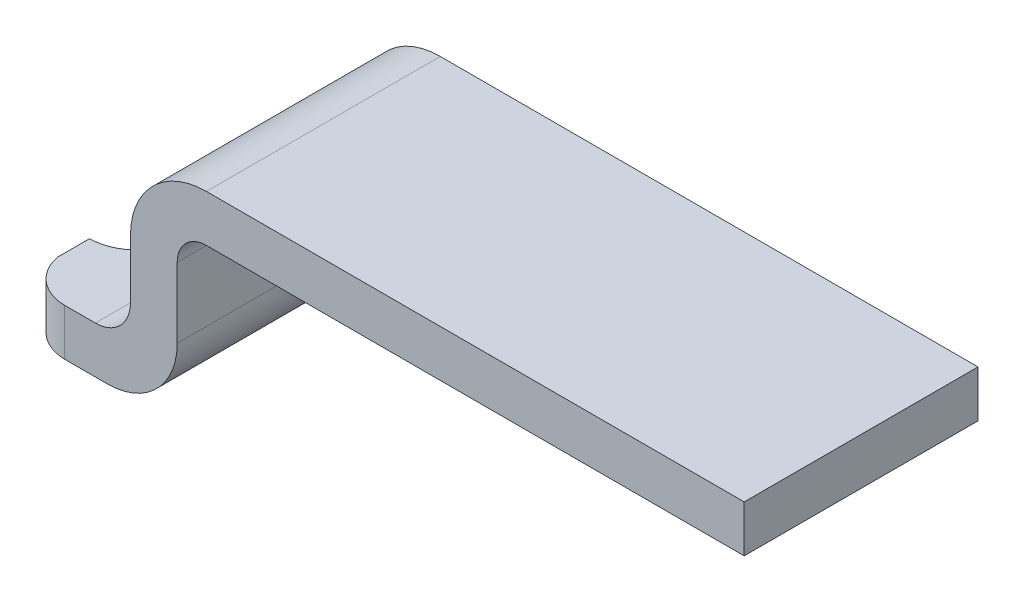
ISO-10303-21;
HEADER;
FILE_DESCRIPTION(('STEP AP214'),'2;1');
FILE_NAME('part.step','',(''),(''),'','','');
FILE_SCHEMA(('AUTOMOTIVE_DESIGN { 1 0 10303 214 1 1 1 1 }'));
ENDSEC;
DATA;
#1=APPLICATION_CONTEXT('core data for automotive mechanical design processes');
#2=APPLICATION_PROTOCOL_DEFINITION('international standard','automotive_design',2000,#1);
#3=PRODUCT_CONTEXT('',#1,'mechanical');
#4=PRODUCT('Part','Part','',(#3));
#5=PRODUCT_RELATED_PRODUCT_CATEGORY('part','',(#4));
#6=PRODUCT_DEFINITION_FORMATION('','',#4);
#7=PRODUCT_DEFINITION_CONTEXT('part definition',#1,'design');
#8=PRODUCT_DEFINITION('design','',#6,#7);
#9=PRODUCT_DEFINITION_SHAPE('','',#8);
#10=(LENGTH_UNIT() NAMED_UNIT(*) SI_UNIT(.MILLI.,.METRE.));
#11=(NAMED_UNIT(*) PLANE_ANGLE_UNIT() SI_UNIT($,.RADIAN.));
#12=(NAMED_UNIT(*) SI_UNIT($,.STERADIAN.) SOLID_ANGLE_UNIT());
#13=UNCERTAINTY_MEASURE_WITH_UNIT(LENGTH_MEASURE(1.E-05),#10,'distance_accuracy_value','');
#14=(GEOMETRIC_REPRESENTATION_CONTEXT(3) GLOBAL_UNCERTAINTY_ASSIGNED_CONTEXT((#13)) GLOBAL_UNIT_ASSIGNED_CONTEXT((#10,
#11,#12)) REPRESENTATION_CONTEXT('',''));
#15=CARTESIAN_POINT('',(0.,0.,0.));
#16=DIRECTION('',(0.,0.,1.));
#17=DIRECTION('',(1.,0.,0.));
#18=AXIS2_PLACEMENT_3D('',#15,#16,#17);
#19=CARTESIAN_POINT('',(-3.45,0.3,-9.));
#20=DIRECTION('',(0.,1.,0.));
#21=DIRECTION('',(1.,0.,0.));
#22=AXIS2_PLACEMENT_3D('',#19,#20,#21);
#23=PLANE('',#22);
#24=DIRECTION('',(0.,0.,-1.));
#25=VECTOR('',#24,1.);
#26=CARTESIAN_POINT('',(-4.1,0.3,-9.));
#27=LINE('',#26,#25);
#28=CARTESIAN_POINT('',(-4.1,0.3,-9.32633336103622));
#29=VERTEX_POINT('',#28);
#30=CARTESIAN_POINT('',(-4.1,0.3,-9.6));
#31=VERTEX_POINT('',#30);
#32=EDGE_CURVE('E42',#29,#31,#27,.T.);
#33=ORIENTED_EDGE('',*,*,#32,.F.);
#34=CARTESIAN_POINT('',(-3.70683202464768,0.3,-9.39994683233988));
#35=DIRECTION('',(0.,1.,0.));
#36=DIRECTION('',(-1.,0.,0.));
#37=AXIS2_PLACEMENT_3D('',#34,#35,#36);
#38=CIRCLE('',#37,0.4);
#39=CARTESIAN_POINT('',(-3.71335362731123,0.3,-9.));
#40=VERTEX_POINT('',#39);
#41=EDGE_CURVE('E11',#29,#40,#38,.T.);
#42=ORIENTED_EDGE('',*,*,#41,.T.);
#43=DIRECTION('',(1.,0.,0.));
#44=VECTOR('',#43,1.);
#45=CARTESIAN_POINT('',(-3.45,0.3,-9.));
#46=LINE('',#45,#44);
#47=CARTESIAN_POINT('',(-3.45,0.3,-9.));
#48=VERTEX_POINT('',#47);
#49=EDGE_CURVE('E28',#40,#48,#46,.T.);
#50=ORIENTED_EDGE('',*,*,#49,.T.);
#51=DIRECTION('',(0.,0.,-1.));
#52=VECTOR('',#51,1.);
#53=CARTESIAN_POINT('',(-3.45,0.3,-9.));
#54=LINE('',#53,#52);
#55=CARTESIAN_POINT('',(-3.45,0.3,-11.));
#56=VERTEX_POINT('',#55);
#57=EDGE_CURVE('E148',#48,#56,#54,.T.);
#58=ORIENTED_EDGE('',*,*,#57,.T.);
#59=DIRECTION('',(1.,0.,0.));
#60=VECTOR('',#59,1.);
#61=CARTESIAN_POINT('',(-3.45,0.3,-11.));
#62=LINE('',#61,#60);
#63=CARTESIAN_POINT('',(-3.7280808421013,0.3,-11.));
#64=VERTEX_POINT('',#63);
#65=EDGE_CURVE('E201',#64,#56,#62,.T.);
#66=ORIENTED_EDGE('',*,*,#65,.F.);
#67=CARTESIAN_POINT('',(-3.70478861389911,0.3,-10.600678735721));
#68=DIRECTION('',(0.,1.,0.));
#69=DIRECTION('',(-1.,0.,0.));
#70=AXIS2_PLACEMENT_3D('',#67,#68,#69);
#71=CIRCLE('',#70,0.399999999999992);
#72=CARTESIAN_POINT('',(-4.1,0.3,-10.6623874085007));
#73=VERTEX_POINT('',#72);
#74=EDGE_CURVE('E268',#64,#73,#71,.T.);
#75=ORIENTED_EDGE('',*,*,#74,.T.);
#76=DIRECTION('',(0.,0.,-1.));
#77=VECTOR('',#76,1.);
#78=CARTESIAN_POINT('',(-4.1,0.3,-9.));
#79=LINE('',#78,#77);
#80=CARTESIAN_POINT('',(-4.1,0.3,-10.4));
#81=VERTEX_POINT('',#80);
#82=EDGE_CURVE('E281',#81,#73,#79,.T.);
#83=ORIENTED_EDGE('',*,*,#82,.F.);
#84=CARTESIAN_POINT('',(-4.1,0.3,-10.));
#85=DIRECTION('',(0.,1.,0.));
#86=DIRECTION('',(-1.,0.,0.));
#87=AXIS2_PLACEMENT_3D('',#84,#85,#86);
#88=CIRCLE('',#87,0.4);
#89=EDGE_CURVE('E212',#31,#81,#88,.T.);
#90=ORIENTED_EDGE('',*,*,#89,.F.);
#91=EDGE_LOOP('',(#33,#42,#50,#58,#66,#75,#83,#90));
#92=FACE_BOUND('',#91,.T.);
#93=ADVANCED_FACE('F17',(#92),#23,.T.);
#94=CARTESIAN_POINT('',(-4.1,0.3,-9.));
#95=DIRECTION('',(-1.,0.,0.));
#96=DIRECTION('',(0.,0.,1.));
#97=AXIS2_PLACEMENT_3D('',#94,#95,#96);
#98=PLANE('',#97);
#99=DIRECTION('',(0.,0.,-1.));
#100=VECTOR('',#99,1.);
#101=CARTESIAN_POINT('',(-4.1,-0.1,-9.));
#102=LINE('',#101,#100);
#103=CARTESIAN_POINT('',(-4.1,-0.1,-9.32633336103622));
#104=VERTEX_POINT('',#103);
#105=CARTESIAN_POINT('',(-4.1,-0.1,-9.6));
#106=VERTEX_POINT('',#105);
#107=EDGE_CURVE('E249',#104,#106,#102,.T.);
#108=ORIENTED_EDGE('',*,*,#107,.F.);
#109=DIRECTION('',(0.,1.,0.));
#110=VECTOR('',#109,1.);
#111=CARTESIAN_POINT('',(-4.1,-0.8,-9.32633336103622));
#112=LINE('',#111,#110);
#113=EDGE_CURVE('E272',#104,#29,#112,.T.);
#114=ORIENTED_EDGE('',*,*,#113,.T.);
#115=ORIENTED_EDGE('',*,*,#32,.T.);
#116=DIRECTION('',(0.,1.,0.));
#117=VECTOR('',#116,1.);
#118=CARTESIAN_POINT('',(-4.1,-0.8,-9.6));
#119=LINE('',#118,#117);
#120=EDGE_CURVE('E213',#106,#31,#119,.T.);
#121=ORIENTED_EDGE('',*,*,#120,.F.);
#122=EDGE_LOOP('',(#108,#114,#115,#121));
#123=FACE_BOUND('',#122,.T.);
#124=ADVANCED_FACE('F341',(#123),#98,.T.);
#125=CARTESIAN_POINT('',(-4.1,0.3,-9.));
#126=DIRECTION('',(-1.,0.,0.));
#127=DIRECTION('',(0.,0.,1.));
#128=AXIS2_PLACEMENT_3D('',#125,#126,#127);
#129=PLANE('',#128);
#130=ORIENTED_EDGE('',*,*,#82,.T.);
#131=DIRECTION('',(0.,1.,0.));
#132=VECTOR('',#131,1.);
#133=CARTESIAN_POINT('',(-4.1,-0.8,-10.6623874085007));
#134=LINE('',#133,#132);
#135=CARTESIAN_POINT('',(-4.1,-0.1,-10.6623874085007));
#136=VERTEX_POINT('',#135);
#137=EDGE_CURVE('E218',#136,#73,#134,.T.);
#138=ORIENTED_EDGE('',*,*,#137,.F.);
#139=DIRECTION('',(0.,0.,-1.));
#140=VECTOR('',#139,1.);
#141=CARTESIAN_POINT('',(-4.1,-0.1,-9.));
#142=LINE('',#141,#140);
#143=CARTESIAN_POINT('',(-4.1,-0.1,-10.4));
#144=VERTEX_POINT('',#143);
#145=EDGE_CURVE('E254',#144,#136,#142,.T.);
#146=ORIENTED_EDGE('',*,*,#145,.F.);
#147=DIRECTION('',(0.,1.,0.));
#148=VECTOR('',#147,1.);
#149=CARTESIAN_POINT('',(-4.1,-0.8,-10.4));
#150=LINE('',#149,#148);
#151=EDGE_CURVE('E294',#144,#81,#150,.T.);
#152=ORIENTED_EDGE('',*,*,#151,.T.);
#153=EDGE_LOOP('',(#130,#138,#146,#152));
#154=FACE_BOUND('',#153,.T.);
#155=ADVANCED_FACE('F328',(#154),#129,.T.);
#156=CARTESIAN_POINT('',(-4.1,-0.1,-9.));
#157=DIRECTION('',(0.,-1.,0.));
#158=DIRECTION('',(-1.,0.,0.));
#159=AXIS2_PLACEMENT_3D('',#156,#157,#158);
#160=PLANE('',#159);
#161=DIRECTION('',(-1.,0.,0.));
#162=VECTOR('',#161,1.);
#163=CARTESIAN_POINT('',(-4.1,-0.1,-9.));
#164=LINE('',#163,#162);
#165=CARTESIAN_POINT('',(-3.35,-0.1,-9.));
#166=VERTEX_POINT('',#165);
#167=CARTESIAN_POINT('',(-3.71335362731091,-0.1,-9.));
#168=VERTEX_POINT('',#167);
#169=EDGE_CURVE('E288',#166,#168,#164,.T.);
#170=ORIENTED_EDGE('',*,*,#169,.T.);
#171=CARTESIAN_POINT('',(-3.70683202464768,-0.1,-9.39994683233988));
#172=DIRECTION('',(0.,-1.,0.));
#173=DIRECTION('',(1.,0.,0.));
#174=AXIS2_PLACEMENT_3D('',#171,#172,#173);
#175=CIRCLE('',#174,0.4);
#176=EDGE_CURVE('E253',#168,#104,#175,.T.);
#177=ORIENTED_EDGE('',*,*,#176,.T.);
#178=ORIENTED_EDGE('',*,*,#107,.T.);
#179=CARTESIAN_POINT('',(-4.1,-0.1,-10.));
#180=DIRECTION('',(0.,-1.,0.));
#181=DIRECTION('',(1.,0.,0.));
#182=AXIS2_PLACEMENT_3D('',#179,#180,#181);
#183=CIRCLE('',#182,0.4);
#184=EDGE_CURVE('E208',#144,#106,#183,.T.);
#185=ORIENTED_EDGE('',*,*,#184,.F.);
#186=ORIENTED_EDGE('',*,*,#145,.T.);
#187=CARTESIAN_POINT('',(-3.70478861389911,-0.1,-10.600678735721));
#188=DIRECTION('',(0.,-1.,0.));
#189=DIRECTION('',(1.,0.,0.));
#190=AXIS2_PLACEMENT_3D('',#187,#188,#189);
#191=CIRCLE('',#190,0.399999999999991);
#192=CARTESIAN_POINT('',(-3.72808084210088,-0.1,-11.));
#193=VERTEX_POINT('',#192);
#194=EDGE_CURVE('E304',#136,#193,#191,.T.);
#195=ORIENTED_EDGE('',*,*,#194,.T.);
#196=DIRECTION('',(-1.,0.,0.));
#197=VECTOR('',#196,1.);
#198=CARTESIAN_POINT('',(-4.1,-0.1,-11.));
#199=LINE('',#198,#197);
#200=CARTESIAN_POINT('',(-3.35,-0.1,-11.));
#201=VERTEX_POINT('',#200);
#202=EDGE_CURVE('E308',#201,#193,#199,.T.);
#203=ORIENTED_EDGE('',*,*,#202,.F.);
#204=DIRECTION('',(0.,0.,-1.));
#205=VECTOR('',#204,1.);
#206=CARTESIAN_POINT('',(-3.35,-0.1,-9.));
#207=LINE('',#206,#205);
#208=EDGE_CURVE('E177',#166,#201,#207,.T.);
#209=ORIENTED_EDGE('',*,*,#208,.F.);
#210=EDGE_LOOP('',(#170,#177,#178,#185,#186,#195,#203,#209));
#211=FACE_BOUND('',#210,.T.);
#212=ADVANCED_FACE('F336',(#211),#160,.T.);
#213=CARTESIAN_POINT('',(-2.5,1.1,-9.));
#214=DIRECTION('',(0.,0.,-1.));
#215=DIRECTION('',(0.,-1.,0.));
#216=AXIS2_PLACEMENT_3D('',#213,#214,#215);
#217=PLANE('',#216);
#218=DIRECTION('',(0.,1.,0.));
#219=VECTOR('',#218,1.);
#220=CARTESIAN_POINT('',(-3.71335362731091,-0.8,-9.));
#221=LINE('',#220,#219);
#222=EDGE_CURVE('E267',#168,#40,#221,.T.);
#223=ORIENTED_EDGE('',*,*,#222,.F.);
#224=ORIENTED_EDGE('',*,*,#169,.F.);
#225=CARTESIAN_POINT('',(-3.35,0.5,-9.));
#226=DIRECTION('',(0.,0.,-1.));
#227=DIRECTION('',(1.,0.,0.));
#228=AXIS2_PLACEMENT_3D('',#225,#226,#227);
#229=CIRCLE('',#228,0.6);
#230=CARTESIAN_POINT('',(-2.75,0.5,-9.));
#231=VERTEX_POINT('',#230);
#232=EDGE_CURVE('E170',#231,#166,#229,.T.);
#233=ORIENTED_EDGE('',*,*,#232,.F.);
#234=DIRECTION('',(0.,-1.,0.));
#235=VECTOR('',#234,1.);
#236=CARTESIAN_POINT('',(-2.75,0.5,-9.));
#237=LINE('',#236,#235);
#238=CARTESIAN_POINT('',(-2.75,1.1,-9.));
#239=VERTEX_POINT('',#238);
#240=EDGE_CURVE('E262',#239,#231,#237,.T.);
#241=ORIENTED_EDGE('',*,*,#240,.F.);
#242=CARTESIAN_POINT('',(-2.5,1.1,-9.));
#243=DIRECTION('',(0.,0.,1.));
#244=DIRECTION('',(-1.,0.,0.));
#245=AXIS2_PLACEMENT_3D('',#242,#243,#244);
#246=CIRCLE('',#245,0.25);
#247=CARTESIAN_POINT('',(-2.5,1.35,-9.));
#248=VERTEX_POINT('',#247);
#249=EDGE_CURVE('E263',#248,#239,#246,.T.);
#250=ORIENTED_EDGE('',*,*,#249,.F.);
#251=DIRECTION('',(-1.,0.,0.));
#252=VECTOR('',#251,1.);
#253=CARTESIAN_POINT('',(2.1,1.35,-9.));
#254=LINE('',#253,#252);
#255=CARTESIAN_POINT('',(2.1,1.35,-9.));
#256=VERTEX_POINT('',#255);
#257=EDGE_CURVE('E182',#256,#248,#254,.T.);
#258=ORIENTED_EDGE('',*,*,#257,.F.);
#259=DIRECTION('',(0.,-1.,0.));
#260=VECTOR('',#259,1.);
#261=CARTESIAN_POINT('',(2.1,1.75,-9.));
#262=LINE('',#261,#260);
#263=CARTESIAN_POINT('',(2.1,1.75,-9.));
#264=VERTEX_POINT('',#263);
#265=EDGE_CURVE('E219',#264,#256,#262,.T.);
#266=ORIENTED_EDGE('',*,*,#265,.F.);
#267=DIRECTION('',(1.,0.,0.));
#268=VECTOR('',#267,1.);
#269=CARTESIAN_POINT('',(2.1,1.75,-9.));
#270=LINE('',#269,#268);
#271=CARTESIAN_POINT('',(-2.5,1.75,-9.));
#272=VERTEX_POINT('',#271);
#273=EDGE_CURVE('E191',#272,#264,#270,.T.);
#274=ORIENTED_EDGE('',*,*,#273,.F.);
#275=CARTESIAN_POINT('',(-2.5,1.1,-9.));
#276=DIRECTION('',(0.,0.,-1.));
#277=DIRECTION('',(1.,0.,0.));
#278=AXIS2_PLACEMENT_3D('',#275,#276,#277);
#279=CIRCLE('',#278,0.65);
#280=CARTESIAN_POINT('',(-3.15,1.1,-9.));
#281=VERTEX_POINT('',#280);
#282=EDGE_CURVE('E159',#281,#272,#279,.T.);
#283=ORIENTED_EDGE('',*,*,#282,.F.);
#284=DIRECTION('',(0.,1.,0.));
#285=VECTOR('',#284,1.);
#286=CARTESIAN_POINT('',(-3.15,1.1,-9.));
#287=LINE('',#286,#285);
#288=CARTESIAN_POINT('',(-3.15,0.6,-9.));
#289=VERTEX_POINT('',#288);
#290=EDGE_CURVE('E155',#289,#281,#287,.T.);
#291=ORIENTED_EDGE('',*,*,#290,.F.);
#292=CARTESIAN_POINT('',(-3.45,0.6,-9.));
#293=DIRECTION('',(0.,0.,1.));
#294=DIRECTION('',(-1.,0.,0.));
#295=AXIS2_PLACEMENT_3D('',#292,#293,#294);
#296=CIRCLE('',#295,0.3);
#297=EDGE_CURVE('E141',#48,#289,#296,.T.);
#298=ORIENTED_EDGE('',*,*,#297,.F.);
#299=ORIENTED_EDGE('',*,*,#49,.F.);
#300=EDGE_LOOP('',(#223,#224,#233,#241,#250,#258,#266,#274,#283,#291,#298,#299));
#301=FACE_BOUND('',#300,.T.);
#302=ADVANCED_FACE('F157',(#301),#217,.F.);
#303=CARTESIAN_POINT('',(-2.5,1.1,-11.));
#304=DIRECTION('',(0.,0.,-1.));
#305=DIRECTION('',(0.,-1.,0.));
#306=AXIS2_PLACEMENT_3D('',#303,#304,#305);
#307=PLANE('',#306);
#308=ORIENTED_EDGE('',*,*,#202,.T.);
#309=DIRECTION('',(0.,1.,0.));
#310=VECTOR('',#309,1.);
#311=CARTESIAN_POINT('',(-3.7280808421013,-0.8,-11.));
#312=LINE('',#311,#310);
#313=EDGE_CURVE('E21',#193,#64,#312,.T.);
#314=ORIENTED_EDGE('',*,*,#313,.T.);
#315=ORIENTED_EDGE('',*,*,#65,.T.);
#316=CARTESIAN_POINT('',(-3.45,0.6,-11.));
#317=DIRECTION('',(0.,0.,1.));
#318=DIRECTION('',(-1.,0.,0.));
#319=AXIS2_PLACEMENT_3D('',#316,#317,#318);
#320=CIRCLE('',#319,0.3);
#321=CARTESIAN_POINT('',(-3.15,0.6,-11.));
#322=VERTEX_POINT('',#321);
#323=EDGE_CURVE('E198',#56,#322,#320,.T.);
#324=ORIENTED_EDGE('',*,*,#323,.T.);
#325=DIRECTION('',(0.,1.,0.));
#326=VECTOR('',#325,1.);
#327=CARTESIAN_POINT('',(-3.15,1.1,-11.));
#328=LINE('',#327,#326);
#329=CARTESIAN_POINT('',(-3.15,1.1,-11.));
#330=VERTEX_POINT('',#329);
#331=EDGE_CURVE('E167',#322,#330,#328,.T.);
#332=ORIENTED_EDGE('',*,*,#331,.T.);
#333=CARTESIAN_POINT('',(-2.5,1.1,-11.));
#334=DIRECTION('',(0.,0.,-1.));
#335=DIRECTION('',(1.,0.,0.));
#336=AXIS2_PLACEMENT_3D('',#333,#334,#335);
#337=CIRCLE('',#336,0.65);
#338=CARTESIAN_POINT('',(-2.5,1.75,-11.));
#339=VERTEX_POINT('',#338);
#340=EDGE_CURVE('E196',#330,#339,#337,.T.);
#341=ORIENTED_EDGE('',*,*,#340,.T.);
#342=DIRECTION('',(1.,0.,0.));
#343=VECTOR('',#342,1.);
#344=CARTESIAN_POINT('',(2.1,1.75,-11.));
#345=LINE('',#344,#343);
#346=CARTESIAN_POINT('',(2.1,1.75,-11.));
#347=VERTEX_POINT('',#346);
#348=EDGE_CURVE('E192',#339,#347,#345,.T.);
#349=ORIENTED_EDGE('',*,*,#348,.T.);
#350=DIRECTION('',(0.,-1.,0.));
#351=VECTOR('',#350,1.);
#352=CARTESIAN_POINT('',(2.1,1.75,-11.));
#353=LINE('',#352,#351);
#354=CARTESIAN_POINT('',(2.1,1.35,-11.));
#355=VERTEX_POINT('',#354);
#356=EDGE_CURVE('E197',#347,#355,#353,.T.);
#357=ORIENTED_EDGE('',*,*,#356,.T.);
#358=DIRECTION('',(-1.,0.,0.));
#359=VECTOR('',#358,1.);
#360=CARTESIAN_POINT('',(2.1,1.35,-11.));
#361=LINE('',#360,#359);
#362=CARTESIAN_POINT('',(-2.5,1.35,-11.));
#363=VERTEX_POINT('',#362);
#364=EDGE_CURVE('E277',#355,#363,#361,.T.);
#365=ORIENTED_EDGE('',*,*,#364,.T.);
#366=CARTESIAN_POINT('',(-2.5,1.1,-11.));
#367=DIRECTION('',(0.,0.,1.));
#368=DIRECTION('',(-1.,0.,0.));
#369=AXIS2_PLACEMENT_3D('',#366,#367,#368);
#370=CIRCLE('',#369,0.25);
#371=CARTESIAN_POINT('',(-2.75,1.1,-11.));
#372=VERTEX_POINT('',#371);
#373=EDGE_CURVE('E245',#363,#372,#370,.T.);
#374=ORIENTED_EDGE('',*,*,#373,.T.);
#375=DIRECTION('',(0.,-1.,0.));
#376=VECTOR('',#375,1.);
#377=CARTESIAN_POINT('',(-2.75,0.5,-11.));
#378=LINE('',#377,#376);
#379=CARTESIAN_POINT('',(-2.75,0.5,-11.));
#380=VERTEX_POINT('',#379);
#381=EDGE_CURVE('E233',#372,#380,#378,.T.);
#382=ORIENTED_EDGE('',*,*,#381,.T.);
#383=CARTESIAN_POINT('',(-3.35,0.5,-11.));
#384=DIRECTION('',(0.,0.,-1.));
#385=DIRECTION('',(1.,0.,0.));
#386=AXIS2_PLACEMENT_3D('',#383,#384,#385);
#387=CIRCLE('',#386,0.6);
#388=EDGE_CURVE('E222',#380,#201,#387,.T.);
#389=ORIENTED_EDGE('',*,*,#388,.T.);
#390=EDGE_LOOP('',(#308,#314,#315,#324,#332,#341,#349,#357,#365,#374,#382,#389));
#391=FACE_BOUND('',#390,.T.);
#392=ADVANCED_FACE('F372',(#391),#307,.T.);
#393=CARTESIAN_POINT('',(2.1,1.75,-9.));
#394=DIRECTION('',(1.,0.,0.));
#395=DIRECTION('',(0.,1.,0.));
#396=AXIS2_PLACEMENT_3D('',#393,#394,#395);
#397=PLANE('',#396);
#398=ORIENTED_EDGE('',*,*,#356,.F.);
#399=DIRECTION('',(0.,0.,-1.));
#400=VECTOR('',#399,1.);
#401=CARTESIAN_POINT('',(2.1,1.75,-9.));
#402=LINE('',#401,#400);
#403=EDGE_CURVE('E187',#264,#347,#402,.T.);
#404=ORIENTED_EDGE('',*,*,#403,.F.);
#405=ORIENTED_EDGE('',*,*,#265,.T.);
#406=DIRECTION('',(0.,0.,-1.));
#407=VECTOR('',#406,1.);
#408=CARTESIAN_POINT('',(2.1,1.35,-9.));
#409=LINE('',#408,#407);
#410=EDGE_CURVE('E204',#256,#355,#409,.T.);
#411=ORIENTED_EDGE('',*,*,#410,.T.);
#412=EDGE_LOOP('',(#398,#404,#405,#411));
#413=FACE_BOUND('',#412,.T.);
#414=ADVANCED_FACE('F717',(#413),#397,.T.);
#415=CARTESIAN_POINT('',(2.1,1.75,-9.));
#416=DIRECTION('',(0.,1.,0.));
#417=DIRECTION('',(1.,0.,0.));
#418=AXIS2_PLACEMENT_3D('',#415,#416,#417);
#419=PLANE('',#418);
#420=ORIENTED_EDGE('',*,*,#348,.F.);
#421=DIRECTION('',(0.,0.,-1.));
#422=VECTOR('',#421,1.);
#423=CARTESIAN_POINT('',(-2.5,1.75,-9.));
#424=LINE('',#423,#422);
#425=EDGE_CURVE('E164',#272,#339,#424,.T.);
#426=ORIENTED_EDGE('',*,*,#425,.F.);
#427=ORIENTED_EDGE('',*,*,#273,.T.);
#428=ORIENTED_EDGE('',*,*,#403,.T.);
#429=EDGE_LOOP('',(#420,#426,#427,#428));
#430=FACE_BOUND('',#429,.T.);
#431=ADVANCED_FACE('F686',(#430),#419,.T.);
#432=CARTESIAN_POINT('',(-2.5,1.1,-9.));
#433=DIRECTION('',(0.,0.,-1.));
#434=DIRECTION('',(-1.,0.,0.));
#435=AXIS2_PLACEMENT_3D('',#432,#433,#434);
#436=CYLINDRICAL_SURFACE('',#435,0.65);
#437=ORIENTED_EDGE('',*,*,#340,.F.);
#438=DIRECTION('',(0.,0.,-1.));
#439=VECTOR('',#438,1.);
#440=CARTESIAN_POINT('',(-3.15,1.1,-9.));
#441=LINE('',#440,#439);
#442=EDGE_CURVE('E152',#281,#330,#441,.T.);
#443=ORIENTED_EDGE('',*,*,#442,.F.);
#444=ORIENTED_EDGE('',*,*,#282,.T.);
#445=ORIENTED_EDGE('',*,*,#425,.T.);
#446=EDGE_LOOP('',(#437,#443,#444,#445));
#447=FACE_BOUND('',#446,.T.);
#448=ADVANCED_FACE('F369',(#447),#436,.T.);
#449=CARTESIAN_POINT('',(-3.15,1.1,-9.));
#450=DIRECTION('',(-1.,0.,0.));
#451=DIRECTION('',(0.,0.,1.));
#452=AXIS2_PLACEMENT_3D('',#449,#450,#451);
#453=PLANE('',#452);
#454=ORIENTED_EDGE('',*,*,#331,.F.);
#455=DIRECTION('',(0.,0.,-1.));
#456=VECTOR('',#455,1.);
#457=CARTESIAN_POINT('',(-3.15,0.6,-9.));
#458=LINE('',#457,#456);
#459=EDGE_CURVE('E146',#289,#322,#458,.T.);
#460=ORIENTED_EDGE('',*,*,#459,.F.);
#461=ORIENTED_EDGE('',*,*,#290,.T.);
#462=ORIENTED_EDGE('',*,*,#442,.T.);
#463=EDGE_LOOP('',(#454,#460,#461,#462));
#464=FACE_BOUND('',#463,.T.);
#465=ADVANCED_FACE('F19',(#464),#453,.T.);
#466=CARTESIAN_POINT('',(-3.45,0.6,-9.));
#467=DIRECTION('',(0.,0.,-1.));
#468=DIRECTION('',(-1.,0.,0.));
#469=AXIS2_PLACEMENT_3D('',#466,#467,#468);
#470=CYLINDRICAL_SURFACE('',#469,0.3);
#471=ORIENTED_EDGE('',*,*,#323,.F.);
#472=ORIENTED_EDGE('',*,*,#57,.F.);
#473=ORIENTED_EDGE('',*,*,#297,.T.);
#474=ORIENTED_EDGE('',*,*,#459,.T.);
#475=EDGE_LOOP('',(#471,#472,#473,#474));
#476=FACE_BOUND('',#475,.T.);
#477=ADVANCED_FACE('F144',(#476),#470,.F.);
#478=CARTESIAN_POINT('',(-3.35,0.5,-9.));
#479=DIRECTION('',(0.,0.,-1.));
#480=DIRECTION('',(-1.,0.,0.));
#481=AXIS2_PLACEMENT_3D('',#478,#479,#480);
#482=CYLINDRICAL_SURFACE('',#481,0.6);
#483=ORIENTED_EDGE('',*,*,#388,.F.);
#484=DIRECTION('',(0.,0.,-1.));
#485=VECTOR('',#484,1.);
#486=CARTESIAN_POINT('',(-2.75,0.5,-9.));
#487=LINE('',#486,#485);
#488=EDGE_CURVE('E258',#231,#380,#487,.T.);
#489=ORIENTED_EDGE('',*,*,#488,.F.);
#490=ORIENTED_EDGE('',*,*,#232,.T.);
#491=ORIENTED_EDGE('',*,*,#208,.T.);
#492=EDGE_LOOP('',(#483,#489,#490,#491));
#493=FACE_BOUND('',#492,.T.);
#494=ADVANCED_FACE('F642',(#493),#482,.T.);
#495=CARTESIAN_POINT('',(-2.75,0.5,-9.));
#496=DIRECTION('',(1.,0.,0.));
#497=DIRECTION('',(0.,1.,0.));
#498=AXIS2_PLACEMENT_3D('',#495,#496,#497);
#499=PLANE('',#498);
#500=ORIENTED_EDGE('',*,*,#381,.F.);
#501=DIRECTION('',(0.,0.,-1.));
#502=VECTOR('',#501,1.);
#503=CARTESIAN_POINT('',(-2.75,1.1,-9.));
#504=LINE('',#503,#502);
#505=EDGE_CURVE('E185',#239,#372,#504,.T.);
#506=ORIENTED_EDGE('',*,*,#505,.F.);
#507=ORIENTED_EDGE('',*,*,#240,.T.);
#508=ORIENTED_EDGE('',*,*,#488,.T.);
#509=EDGE_LOOP('',(#500,#506,#507,#508));
#510=FACE_BOUND('',#509,.T.);
#511=ADVANCED_FACE('F620',(#510),#499,.T.);
#512=CARTESIAN_POINT('',(-2.5,1.1,-9.));
#513=DIRECTION('',(0.,0.,-1.));
#514=DIRECTION('',(-1.,0.,0.));
#515=AXIS2_PLACEMENT_3D('',#512,#513,#514);
#516=CYLINDRICAL_SURFACE('',#515,0.25);
#517=ORIENTED_EDGE('',*,*,#373,.F.);
#518=DIRECTION('',(0.,0.,-1.));
#519=VECTOR('',#518,1.);
#520=CARTESIAN_POINT('',(-2.5,1.35,-9.));
#521=LINE('',#520,#519);
#522=EDGE_CURVE('E186',#248,#363,#521,.T.);
#523=ORIENTED_EDGE('',*,*,#522,.F.);
#524=ORIENTED_EDGE('',*,*,#249,.T.);
#525=ORIENTED_EDGE('',*,*,#505,.T.);
#526=EDGE_LOOP('',(#517,#523,#524,#525));
#527=FACE_BOUND('',#526,.T.);
#528=ADVANCED_FACE('F614',(#527),#516,.F.);
#529=CARTESIAN_POINT('',(2.1,1.35,-9.));
#530=DIRECTION('',(0.,-1.,0.));
#531=DIRECTION('',(0.,0.,-1.));
#532=AXIS2_PLACEMENT_3D('',#529,#530,#531);
#533=PLANE('',#532);
#534=ORIENTED_EDGE('',*,*,#364,.F.);
#535=ORIENTED_EDGE('',*,*,#410,.F.);
#536=ORIENTED_EDGE('',*,*,#257,.T.);
#537=ORIENTED_EDGE('',*,*,#522,.T.);
#538=EDGE_LOOP('',(#534,#535,#536,#537));
#539=FACE_BOUND('',#538,.T.);
#540=ADVANCED_FACE('F619',(#539),#533,.T.);
#541=CARTESIAN_POINT('',(-3.70478861389911,-0.8,-10.600678735721));
#542=DIRECTION('',(0.,1.,0.));
#543=DIRECTION('',(0.,0.,1.));
#544=AXIS2_PLACEMENT_3D('',#541,#542,#543);
#545=CYLINDRICAL_SURFACE('',#544,0.399999999999991);
#546=ORIENTED_EDGE('',*,*,#313,.F.);
#547=ORIENTED_EDGE('',*,*,#194,.F.);
#548=ORIENTED_EDGE('',*,*,#137,.T.);
#549=ORIENTED_EDGE('',*,*,#74,.F.);
#550=EDGE_LOOP('',(#546,#547,#548,#549));
#551=FACE_BOUND('',#550,.T.);
#552=ADVANCED_FACE('F654',(#551),#545,.T.);
#553=CARTESIAN_POINT('',(-3.70683202464768,-0.8,-9.39994683233988));
#554=DIRECTION('',(0.,1.,0.));
#555=DIRECTION('',(0.,0.,1.));
#556=AXIS2_PLACEMENT_3D('',#553,#554,#555);
#557=CYLINDRICAL_SURFACE('',#556,0.4);
#558=ORIENTED_EDGE('',*,*,#113,.F.);
#559=ORIENTED_EDGE('',*,*,#176,.F.);
#560=ORIENTED_EDGE('',*,*,#222,.T.);
#561=ORIENTED_EDGE('',*,*,#41,.F.);
#562=EDGE_LOOP('',(#558,#559,#560,#561));
#563=FACE_BOUND('',#562,.T.);
#564=ADVANCED_FACE('F343',(#563),#557,.T.);
#565=CARTESIAN_POINT('',(-4.1,-0.8,-10.));
#566=DIRECTION('',(0.,1.,0.));
#567=DIRECTION('',(0.,0.,1.));
#568=AXIS2_PLACEMENT_3D('',#565,#566,#567);
#569=CYLINDRICAL_SURFACE('',#568,0.4);
#570=ORIENTED_EDGE('',*,*,#89,.T.);
#571=ORIENTED_EDGE('',*,*,#151,.F.);
#572=ORIENTED_EDGE('',*,*,#184,.T.);
#573=ORIENTED_EDGE('',*,*,#120,.T.);
#574=EDGE_LOOP('',(#570,#571,#572,#573));
#575=FACE_BOUND('',#574,.T.);
#576=ADVANCED_FACE('F333',(#575),#569,.F.);
#577=CLOSED_SHELL('',(#93,#124,#155,#212,#302,#392,#414,#431,#448,#465,#477,#494,#511,#528,#540,
#552,#564,#576));
#578=MANIFOLD_SOLID_BREP('B1',#577);
#579=ADVANCED_BREP_SHAPE_REPRESENTATION('',(#18,#578),#14);
#580=SHAPE_DEFINITION_REPRESENTATION(#9,#579);
ENDSEC;
END-ISO-10303-21;
